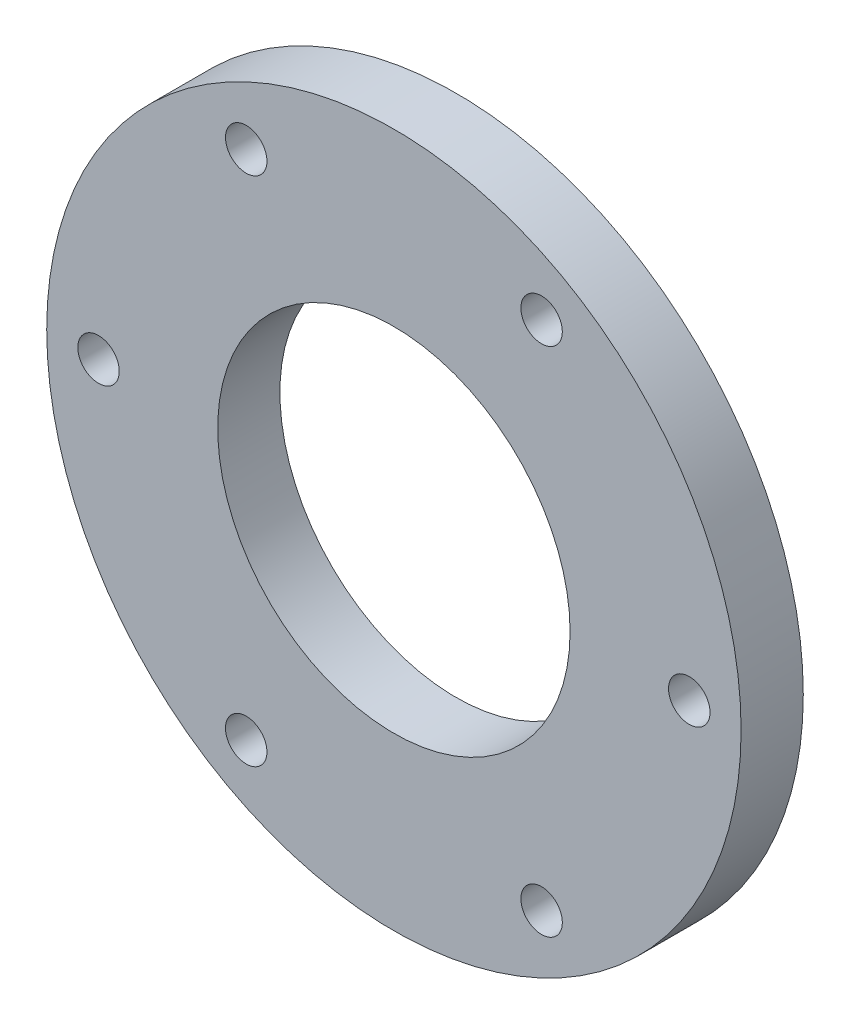
ISO-10303-21;
HEADER;
FILE_DESCRIPTION(('STEP AP214'),'2;1');
FILE_NAME('part.step','',(''),(''),'','','');
FILE_SCHEMA(('AUTOMOTIVE_DESIGN { 1 0 10303 214 1 1 1 1 }'));
ENDSEC;
DATA;
#1=APPLICATION_CONTEXT('core data for automotive mechanical design processes');
#2=APPLICATION_PROTOCOL_DEFINITION('international standard','automotive_design',2000,#1);
#3=PRODUCT_CONTEXT('',#1,'mechanical');
#4=PRODUCT('Part','Part','',(#3));
#5=PRODUCT_RELATED_PRODUCT_CATEGORY('part','',(#4));
#6=PRODUCT_DEFINITION_FORMATION('','',#4);
#7=PRODUCT_DEFINITION_CONTEXT('part definition',#1,'design');
#8=PRODUCT_DEFINITION('design','',#6,#7);
#9=PRODUCT_DEFINITION_SHAPE('','',#8);
#10=(LENGTH_UNIT() NAMED_UNIT(*) SI_UNIT(.MILLI.,.METRE.));
#11=(NAMED_UNIT(*) PLANE_ANGLE_UNIT() SI_UNIT($,.RADIAN.));
#12=(NAMED_UNIT(*) SI_UNIT($,.STERADIAN.) SOLID_ANGLE_UNIT());
#13=UNCERTAINTY_MEASURE_WITH_UNIT(LENGTH_MEASURE(1.E-05),#10,'distance_accuracy_value','');
#14=(GEOMETRIC_REPRESENTATION_CONTEXT(3) GLOBAL_UNCERTAINTY_ASSIGNED_CONTEXT((#13)) GLOBAL_UNIT_ASSIGNED_CONTEXT((#10,
#11,#12)) REPRESENTATION_CONTEXT('',''));
#15=CARTESIAN_POINT('',(0.,0.,0.));
#16=DIRECTION('',(0.,0.,1.));
#17=DIRECTION('',(1.,0.,0.));
#18=AXIS2_PLACEMENT_3D('',#15,#16,#17);
#19=CARTESIAN_POINT('',(0.,0.,6.));
#20=DIRECTION('',(0.,0.,1.));
#21=DIRECTION('',(1.,0.,0.));
#22=AXIS2_PLACEMENT_3D('',#19,#20,#21);
#23=PLANE('',#22);
#24=CARTESIAN_POINT('',(28.5,0.,6.));
#25=DIRECTION('',(0.,0.,1.));
#26=DIRECTION('',(1.,0.,0.));
#27=AXIS2_PLACEMENT_3D('',#24,#25,#26);
#28=CIRCLE('',#27,1.99999999999999);
#29=CARTESIAN_POINT('',(30.5,0.,6.));
#30=VERTEX_POINT('',#29);
#31=EDGE_CURVE('E36',#30,#30,#28,.T.);
#32=ORIENTED_EDGE('',*,*,#31,.F.);
#33=EDGE_LOOP('',(#32));
#34=FACE_BOUND('',#33,.T.);
#35=CARTESIAN_POINT('',(14.2499999999999,24.6817240078565,6.));
#36=DIRECTION('',(0.,0.,1.));
#37=DIRECTION('',(1.,0.,0.));
#38=AXIS2_PLACEMENT_3D('',#35,#36,#37);
#39=CIRCLE('',#38,1.99999999999999);
#40=CARTESIAN_POINT('',(16.2499999999999,24.6817240078565,6.));
#41=VERTEX_POINT('',#40);
#42=EDGE_CURVE('E69',#41,#41,#39,.T.);
#43=ORIENTED_EDGE('',*,*,#42,.F.);
#44=EDGE_LOOP('',(#43));
#45=FACE_BOUND('',#44,.T.);
#46=CARTESIAN_POINT('',(-14.2500000000001,24.6817240078564,6.));
#47=DIRECTION('',(0.,0.,1.));
#48=DIRECTION('',(1.,0.,0.));
#49=AXIS2_PLACEMENT_3D('',#46,#47,#48);
#50=CIRCLE('',#49,1.99999999999999);
#51=CARTESIAN_POINT('',(-12.2500000000001,24.6817240078564,6.));
#52=VERTEX_POINT('',#51);
#53=EDGE_CURVE('E65',#52,#52,#50,.T.);
#54=ORIENTED_EDGE('',*,*,#53,.F.);
#55=EDGE_LOOP('',(#54));
#56=FACE_BOUND('',#55,.T.);
#57=CARTESIAN_POINT('',(-28.5,-1.99014436314059E-13,6.));
#58=DIRECTION('',(0.,0.,1.));
#59=DIRECTION('',(1.,0.,0.));
#60=AXIS2_PLACEMENT_3D('',#57,#58,#59);
#61=CIRCLE('',#60,1.99999999999999);
#62=CARTESIAN_POINT('',(-26.5,-1.99014436314059E-13,6.));
#63=VERTEX_POINT('',#62);
#64=EDGE_CURVE('E60',#63,#63,#61,.T.);
#65=ORIENTED_EDGE('',*,*,#64,.F.);
#66=EDGE_LOOP('',(#65));
#67=FACE_BOUND('',#66,.T.);
#68=CARTESIAN_POINT('',(-14.2499999999998,-24.6817240078566,6.));
#69=DIRECTION('',(0.,0.,1.));
#70=DIRECTION('',(1.,0.,0.));
#71=AXIS2_PLACEMENT_3D('',#68,#69,#70);
#72=CIRCLE('',#71,1.99999999999999);
#73=CARTESIAN_POINT('',(-12.2499999999998,-24.6817240078566,6.));
#74=VERTEX_POINT('',#73);
#75=EDGE_CURVE('E55',#74,#74,#72,.T.);
#76=ORIENTED_EDGE('',*,*,#75,.F.);
#77=EDGE_LOOP('',(#76));
#78=FACE_BOUND('',#77,.T.);
#79=CARTESIAN_POINT('',(14.2500000000003,-24.6817240078563,6.));
#80=DIRECTION('',(0.,0.,1.));
#81=DIRECTION('',(1.,0.,0.));
#82=AXIS2_PLACEMENT_3D('',#79,#80,#81);
#83=CIRCLE('',#82,1.99999999999999);
#84=CARTESIAN_POINT('',(16.2500000000003,-24.6817240078563,6.));
#85=VERTEX_POINT('',#84);
#86=EDGE_CURVE('E51',#85,#85,#83,.T.);
#87=ORIENTED_EDGE('',*,*,#86,.F.);
#88=EDGE_LOOP('',(#87));
#89=FACE_BOUND('',#88,.T.);
#90=CARTESIAN_POINT('',(0.,0.,6.));
#91=DIRECTION('',(0.,0.,1.));
#92=DIRECTION('',(1.,0.,0.));
#93=AXIS2_PLACEMENT_3D('',#90,#91,#92);
#94=CIRCLE('',#93,33.5);
#95=CARTESIAN_POINT('',(33.5,0.,6.));
#96=VERTEX_POINT('',#95);
#97=EDGE_CURVE('E10',#96,#96,#94,.T.);
#98=ORIENTED_EDGE('',*,*,#97,.T.);
#99=EDGE_LOOP('',(#98));
#100=FACE_BOUND('',#99,.T.);
#101=CARTESIAN_POINT('',(0.,0.,6.));
#102=DIRECTION('',(0.,0.,1.));
#103=DIRECTION('',(1.,0.,0.));
#104=AXIS2_PLACEMENT_3D('',#101,#102,#103);
#105=CIRCLE('',#104,17.);
#106=CARTESIAN_POINT('',(17.,0.,6.));
#107=VERTEX_POINT('',#106);
#108=EDGE_CURVE('E45',#107,#107,#105,.T.);
#109=ORIENTED_EDGE('',*,*,#108,.F.);
#110=EDGE_LOOP('',(#109));
#111=FACE_BOUND('',#110,.T.);
#112=ADVANCED_FACE('F32',(#34,#45,#56,#67,#78,#89,#100,#111),#23,.T.);
#113=CARTESIAN_POINT('',(0.,0.,0.));
#114=DIRECTION('',(0.,0.,1.));
#115=DIRECTION('',(1.,0.,0.));
#116=AXIS2_PLACEMENT_3D('',#113,#114,#115);
#117=PLANE('',#116);
#118=CARTESIAN_POINT('',(28.5,0.,0.));
#119=DIRECTION('',(0.,0.,-1.));
#120=DIRECTION('',(-1.,0.,0.));
#121=AXIS2_PLACEMENT_3D('',#118,#119,#120);
#122=CIRCLE('',#121,2.025);
#123=CARTESIAN_POINT('',(26.475,0.,0.));
#124=VERTEX_POINT('',#123);
#125=EDGE_CURVE('E198',#124,#124,#122,.T.);
#126=ORIENTED_EDGE('',*,*,#125,.F.);
#127=EDGE_LOOP('',(#126));
#128=FACE_BOUND('',#127,.T.);
#129=CARTESIAN_POINT('',(14.2499999999999,24.6817240078565,0.));
#130=DIRECTION('',(0.,0.,-1.));
#131=DIRECTION('',(-1.,0.,0.));
#132=AXIS2_PLACEMENT_3D('',#129,#130,#131);
#133=CIRCLE('',#132,2.025);
#134=CARTESIAN_POINT('',(12.2249999999999,24.6817240078565,0.));
#135=VERTEX_POINT('',#134);
#136=EDGE_CURVE('E78',#135,#135,#133,.T.);
#137=ORIENTED_EDGE('',*,*,#136,.F.);
#138=EDGE_LOOP('',(#137));
#139=FACE_BOUND('',#138,.T.);
#140=CARTESIAN_POINT('',(-14.2500000000001,24.6817240078564,0.));
#141=DIRECTION('',(0.,0.,-1.));
#142=DIRECTION('',(-1.,0.,0.));
#143=AXIS2_PLACEMENT_3D('',#140,#141,#142);
#144=CIRCLE('',#143,2.025);
#145=CARTESIAN_POINT('',(-16.2750000000001,24.6817240078564,0.));
#146=VERTEX_POINT('',#145);
#147=EDGE_CURVE('E71',#146,#146,#144,.T.);
#148=ORIENTED_EDGE('',*,*,#147,.F.);
#149=EDGE_LOOP('',(#148));
#150=FACE_BOUND('',#149,.T.);
#151=CARTESIAN_POINT('',(-28.5,-1.99014436314059E-13,0.));
#152=DIRECTION('',(0.,0.,-1.));
#153=DIRECTION('',(-1.,0.,0.));
#154=AXIS2_PLACEMENT_3D('',#151,#152,#153);
#155=CIRCLE('',#154,2.025);
#156=CARTESIAN_POINT('',(-30.525,-1.99014436314059E-13,0.));
#157=VERTEX_POINT('',#156);
#158=EDGE_CURVE('E67',#157,#157,#155,.T.);
#159=ORIENTED_EDGE('',*,*,#158,.F.);
#160=EDGE_LOOP('',(#159));
#161=FACE_BOUND('',#160,.T.);
#162=CARTESIAN_POINT('',(-14.2499999999998,-24.6817240078566,0.));
#163=DIRECTION('',(0.,0.,-1.));
#164=DIRECTION('',(-1.,0.,0.));
#165=AXIS2_PLACEMENT_3D('',#162,#163,#164);
#166=CIRCLE('',#165,2.025);
#167=CARTESIAN_POINT('',(-16.2749999999998,-24.6817240078566,0.));
#168=VERTEX_POINT('',#167);
#169=EDGE_CURVE('E63',#168,#168,#166,.T.);
#170=ORIENTED_EDGE('',*,*,#169,.F.);
#171=EDGE_LOOP('',(#170));
#172=FACE_BOUND('',#171,.T.);
#173=CARTESIAN_POINT('',(14.2500000000003,-24.6817240078563,0.));
#174=DIRECTION('',(0.,0.,-1.));
#175=DIRECTION('',(-1.,0.,0.));
#176=AXIS2_PLACEMENT_3D('',#173,#174,#175);
#177=CIRCLE('',#176,2.025);
#178=CARTESIAN_POINT('',(12.2250000000003,-24.6817240078563,0.));
#179=VERTEX_POINT('',#178);
#180=EDGE_CURVE('E58',#179,#179,#177,.T.);
#181=ORIENTED_EDGE('',*,*,#180,.F.);
#182=EDGE_LOOP('',(#181));
#183=FACE_BOUND('',#182,.T.);
#184=CARTESIAN_POINT('',(0.,0.,0.));
#185=DIRECTION('',(0.,0.,1.));
#186=DIRECTION('',(1.,0.,0.));
#187=AXIS2_PLACEMENT_3D('',#184,#185,#186);
#188=CIRCLE('',#187,33.5);
#189=CARTESIAN_POINT('',(33.5,0.,0.));
#190=VERTEX_POINT('',#189);
#191=EDGE_CURVE('E40',#190,#190,#188,.T.);
#192=ORIENTED_EDGE('',*,*,#191,.F.);
#193=EDGE_LOOP('',(#192));
#194=FACE_BOUND('',#193,.T.);
#195=CARTESIAN_POINT('',(0.,0.,0.));
#196=DIRECTION('',(0.,0.,1.));
#197=DIRECTION('',(1.,0.,0.));
#198=AXIS2_PLACEMENT_3D('',#195,#196,#197);
#199=CIRCLE('',#198,17.);
#200=CARTESIAN_POINT('',(17.,0.,0.));
#201=VERTEX_POINT('',#200);
#202=EDGE_CURVE('E48',#201,#201,#199,.T.);
#203=ORIENTED_EDGE('',*,*,#202,.T.);
#204=EDGE_LOOP('',(#203));
#205=FACE_BOUND('',#204,.T.);
#206=ADVANCED_FACE('F105',(#128,#139,#150,#161,#172,#183,#194,#205),#117,.F.);
#207=CARTESIAN_POINT('',(0.,0.,6.));
#208=DIRECTION('',(0.,0.,-1.));
#209=DIRECTION('',(-1.,0.,0.));
#210=AXIS2_PLACEMENT_3D('',#207,#208,#209);
#211=CYLINDRICAL_SURFACE('',#210,33.5);
#212=ORIENTED_EDGE('',*,*,#97,.F.);
#213=EDGE_LOOP('',(#212));
#214=FACE_BOUND('',#213,.T.);
#215=ORIENTED_EDGE('',*,*,#191,.T.);
#216=EDGE_LOOP('',(#215));
#217=FACE_BOUND('',#216,.T.);
#218=ADVANCED_FACE('F34',(#214,#217),#211,.T.);
#219=CARTESIAN_POINT('',(0.,0.,6.));
#220=DIRECTION('',(0.,0.,-1.));
#221=DIRECTION('',(-1.,0.,0.));
#222=AXIS2_PLACEMENT_3D('',#219,#220,#221);
#223=CYLINDRICAL_SURFACE('',#222,17.);
#224=ORIENTED_EDGE('',*,*,#108,.T.);
#225=EDGE_LOOP('',(#224));
#226=FACE_BOUND('',#225,.T.);
#227=ORIENTED_EDGE('',*,*,#202,.F.);
#228=EDGE_LOOP('',(#227));
#229=FACE_BOUND('',#228,.T.);
#230=ADVANCED_FACE('F107',(#226,#229),#223,.F.);
#231=CARTESIAN_POINT('',(14.2500000000003,-24.6817240078563,0.));
#232=DIRECTION('',(0.,0.,-1.));
#233=DIRECTION('',(-1.,0.,0.));
#234=AXIS2_PLACEMENT_3D('',#231,#232,#233);
#235=CYLINDRICAL_SURFACE('',#234,1.99999999999999);
#236=ORIENTED_EDGE('',*,*,#86,.T.);
#237=EDGE_LOOP('',(#236));
#238=FACE_BOUND('',#237,.T.);
#239=CARTESIAN_POINT('',(14.2500000000003,-24.6817240078563,0.0250000000000111));
#240=DIRECTION('',(0.,0.,-1.));
#241=DIRECTION('',(-1.,0.,0.));
#242=AXIS2_PLACEMENT_3D('',#239,#240,#241);
#243=CIRCLE('',#242,1.99999999999999);
#244=CARTESIAN_POINT('',(12.2500000000003,-24.6817240078563,0.0250000000000111));
#245=VERTEX_POINT('',#244);
#246=EDGE_CURVE('E54',#245,#245,#243,.T.);
#247=ORIENTED_EDGE('',*,*,#246,.T.);
#248=EDGE_LOOP('',(#247));
#249=FACE_BOUND('',#248,.T.);
#250=ADVANCED_FACE('F109',(#238,#249),#235,.F.);
#251=CARTESIAN_POINT('',(14.2500000000003,-24.6817240078563,0.));
#252=DIRECTION('',(0.,0.,-1.));
#253=DIRECTION('',(-1.,0.,0.));
#254=AXIS2_PLACEMENT_3D('',#251,#252,#253);
#255=CONICAL_SURFACE('',#254,2.025,0.785398163397414);
#256=ORIENTED_EDGE('',*,*,#246,.F.);
#257=EDGE_LOOP('',(#256));
#258=FACE_BOUND('',#257,.T.);
#259=ORIENTED_EDGE('',*,*,#180,.T.);
#260=EDGE_LOOP('',(#259));
#261=FACE_BOUND('',#260,.T.);
#262=ADVANCED_FACE('F115',(#258,#261),#255,.F.);
#263=CARTESIAN_POINT('',(-14.2499999999998,-24.6817240078566,0.));
#264=DIRECTION('',(0.,0.,-1.));
#265=DIRECTION('',(-1.,0.,0.));
#266=AXIS2_PLACEMENT_3D('',#263,#264,#265);
#267=CYLINDRICAL_SURFACE('',#266,1.99999999999999);
#268=ORIENTED_EDGE('',*,*,#75,.T.);
#269=EDGE_LOOP('',(#268));
#270=FACE_BOUND('',#269,.T.);
#271=CARTESIAN_POINT('',(-14.2499999999998,-24.6817240078566,0.0250000000000111));
#272=DIRECTION('',(0.,0.,-1.));
#273=DIRECTION('',(-1.,0.,0.));
#274=AXIS2_PLACEMENT_3D('',#271,#272,#273);
#275=CIRCLE('',#274,1.99999999999999);
#276=CARTESIAN_POINT('',(-16.2499999999998,-24.6817240078566,0.0250000000000111));
#277=VERTEX_POINT('',#276);
#278=EDGE_CURVE('E59',#277,#277,#275,.T.);
#279=ORIENTED_EDGE('',*,*,#278,.T.);
#280=EDGE_LOOP('',(#279));
#281=FACE_BOUND('',#280,.T.);
#282=ADVANCED_FACE('F143',(#270,#281),#267,.F.);
#283=CARTESIAN_POINT('',(-14.2499999999998,-24.6817240078566,0.));
#284=DIRECTION('',(0.,0.,-1.));
#285=DIRECTION('',(-1.,0.,0.));
#286=AXIS2_PLACEMENT_3D('',#283,#284,#285);
#287=CONICAL_SURFACE('',#286,2.025,0.785398163397379);
#288=ORIENTED_EDGE('',*,*,#278,.F.);
#289=EDGE_LOOP('',(#288));
#290=FACE_BOUND('',#289,.T.);
#291=ORIENTED_EDGE('',*,*,#169,.T.);
#292=EDGE_LOOP('',(#291));
#293=FACE_BOUND('',#292,.T.);
#294=ADVANCED_FACE('F153',(#290,#293),#287,.F.);
#295=CARTESIAN_POINT('',(-28.5,-1.99014436314059E-13,0.));
#296=DIRECTION('',(0.,0.,-1.));
#297=DIRECTION('',(-1.,0.,0.));
#298=AXIS2_PLACEMENT_3D('',#295,#296,#297);
#299=CYLINDRICAL_SURFACE('',#298,1.99999999999999);
#300=ORIENTED_EDGE('',*,*,#64,.T.);
#301=EDGE_LOOP('',(#300));
#302=FACE_BOUND('',#301,.T.);
#303=CARTESIAN_POINT('',(-28.5,-1.99014436314059E-13,0.0250000000000111));
#304=DIRECTION('',(0.,0.,-1.));
#305=DIRECTION('',(-1.,0.,0.));
#306=AXIS2_PLACEMENT_3D('',#303,#304,#305);
#307=CIRCLE('',#306,1.99999999999999);
#308=CARTESIAN_POINT('',(-30.5,-1.99014436314059E-13,0.0250000000000111));
#309=VERTEX_POINT('',#308);
#310=EDGE_CURVE('E64',#309,#309,#307,.T.);
#311=ORIENTED_EDGE('',*,*,#310,.T.);
#312=EDGE_LOOP('',(#311));
#313=FACE_BOUND('',#312,.T.);
#314=ADVANCED_FACE('F159',(#302,#313),#299,.F.);
#315=CARTESIAN_POINT('',(-28.5,-1.99014436314059E-13,0.));
#316=DIRECTION('',(0.,0.,-1.));
#317=DIRECTION('',(-1.,0.,0.));
#318=AXIS2_PLACEMENT_3D('',#315,#316,#317);
#319=CONICAL_SURFACE('',#318,2.025,0.785398163397344);
#320=ORIENTED_EDGE('',*,*,#310,.F.);
#321=EDGE_LOOP('',(#320));
#322=FACE_BOUND('',#321,.T.);
#323=ORIENTED_EDGE('',*,*,#158,.T.);
#324=EDGE_LOOP('',(#323));
#325=FACE_BOUND('',#324,.T.);
#326=ADVANCED_FACE('F163',(#322,#325),#319,.F.);
#327=CARTESIAN_POINT('',(-14.2500000000001,24.6817240078564,0.));
#328=DIRECTION('',(0.,0.,-1.));
#329=DIRECTION('',(-1.,0.,0.));
#330=AXIS2_PLACEMENT_3D('',#327,#328,#329);
#331=CYLINDRICAL_SURFACE('',#330,1.99999999999999);
#332=ORIENTED_EDGE('',*,*,#53,.T.);
#333=EDGE_LOOP('',(#332));
#334=FACE_BOUND('',#333,.T.);
#335=CARTESIAN_POINT('',(-14.2500000000001,24.6817240078564,0.0250000000000111));
#336=DIRECTION('',(0.,0.,-1.));
#337=DIRECTION('',(-1.,0.,0.));
#338=AXIS2_PLACEMENT_3D('',#335,#336,#337);
#339=CIRCLE('',#338,1.99999999999999);
#340=CARTESIAN_POINT('',(-16.2500000000001,24.6817240078564,0.0250000000000111));
#341=VERTEX_POINT('',#340);
#342=EDGE_CURVE('E68',#341,#341,#339,.T.);
#343=ORIENTED_EDGE('',*,*,#342,.T.);
#344=EDGE_LOOP('',(#343));
#345=FACE_BOUND('',#344,.T.);
#346=ADVANCED_FACE('F167',(#334,#345),#331,.F.);
#347=CARTESIAN_POINT('',(-14.2500000000001,24.6817240078564,0.));
#348=DIRECTION('',(0.,0.,-1.));
#349=DIRECTION('',(-1.,0.,0.));
#350=AXIS2_PLACEMENT_3D('',#347,#348,#349);
#351=CONICAL_SURFACE('',#350,2.025,0.785398163397379);
#352=ORIENTED_EDGE('',*,*,#342,.F.);
#353=EDGE_LOOP('',(#352));
#354=FACE_BOUND('',#353,.T.);
#355=ORIENTED_EDGE('',*,*,#147,.T.);
#356=EDGE_LOOP('',(#355));
#357=FACE_BOUND('',#356,.T.);
#358=ADVANCED_FACE('F171',(#354,#357),#351,.F.);
#359=CARTESIAN_POINT('',(14.2499999999999,24.6817240078565,0.));
#360=DIRECTION('',(0.,0.,-1.));
#361=DIRECTION('',(-1.,0.,0.));
#362=AXIS2_PLACEMENT_3D('',#359,#360,#361);
#363=CYLINDRICAL_SURFACE('',#362,1.99999999999999);
#364=ORIENTED_EDGE('',*,*,#42,.T.);
#365=EDGE_LOOP('',(#364));
#366=FACE_BOUND('',#365,.T.);
#367=CARTESIAN_POINT('',(14.2499999999999,24.6817240078565,0.0250000000000111));
#368=DIRECTION('',(0.,0.,-1.));
#369=DIRECTION('',(-1.,0.,0.));
#370=AXIS2_PLACEMENT_3D('',#367,#368,#369);
#371=CIRCLE('',#370,1.99999999999999);
#372=CARTESIAN_POINT('',(12.25,24.6817240078565,0.0250000000000111));
#373=VERTEX_POINT('',#372);
#374=EDGE_CURVE('E72',#373,#373,#371,.T.);
#375=ORIENTED_EDGE('',*,*,#374,.T.);
#376=EDGE_LOOP('',(#375));
#377=FACE_BOUND('',#376,.T.);
#378=ADVANCED_FACE('F175',(#366,#377),#363,.F.);
#379=CARTESIAN_POINT('',(14.2499999999999,24.6817240078565,0.));
#380=DIRECTION('',(0.,0.,-1.));
#381=DIRECTION('',(-1.,0.,0.));
#382=AXIS2_PLACEMENT_3D('',#379,#380,#381);
#383=CONICAL_SURFACE('',#382,2.025,0.785398163397414);
#384=ORIENTED_EDGE('',*,*,#374,.F.);
#385=EDGE_LOOP('',(#384));
#386=FACE_BOUND('',#385,.T.);
#387=ORIENTED_EDGE('',*,*,#136,.T.);
#388=EDGE_LOOP('',(#387));
#389=FACE_BOUND('',#388,.T.);
#390=ADVANCED_FACE('F179',(#386,#389),#383,.F.);
#391=CARTESIAN_POINT('',(28.5,0.,0.));
#392=DIRECTION('',(0.,0.,-1.));
#393=DIRECTION('',(-1.,0.,0.));
#394=AXIS2_PLACEMENT_3D('',#391,#392,#393);
#395=CYLINDRICAL_SURFACE('',#394,1.99999999999999);
#396=ORIENTED_EDGE('',*,*,#31,.T.);
#397=EDGE_LOOP('',(#396));
#398=FACE_BOUND('',#397,.T.);
#399=CARTESIAN_POINT('',(28.5,0.,0.0250000000000111));
#400=DIRECTION('',(0.,0.,-1.));
#401=DIRECTION('',(-1.,0.,0.));
#402=AXIS2_PLACEMENT_3D('',#399,#400,#401);
#403=CIRCLE('',#402,1.99999999999999);
#404=CARTESIAN_POINT('',(26.5,0.,0.0250000000000111));
#405=VERTEX_POINT('',#404);
#406=EDGE_CURVE('E195',#405,#405,#403,.T.);
#407=ORIENTED_EDGE('',*,*,#406,.T.);
#408=EDGE_LOOP('',(#407));
#409=FACE_BOUND('',#408,.T.);
#410=ADVANCED_FACE('F182',(#398,#409),#395,.F.);
#411=CARTESIAN_POINT('',(28.5,0.,0.));
#412=DIRECTION('',(0.,0.,-1.));
#413=DIRECTION('',(-1.,0.,0.));
#414=AXIS2_PLACEMENT_3D('',#411,#412,#413);
#415=CONICAL_SURFACE('',#414,2.025,0.785398163397344);
#416=ORIENTED_EDGE('',*,*,#406,.F.);
#417=EDGE_LOOP('',(#416));
#418=FACE_BOUND('',#417,.T.);
#419=ORIENTED_EDGE('',*,*,#125,.T.);
#420=EDGE_LOOP('',(#419));
#421=FACE_BOUND('',#420,.T.);
#422=ADVANCED_FACE('F186',(#418,#421),#415,.F.);
#423=CLOSED_SHELL('',(#112,#206,#218,#230,#250,#262,#282,#294,#314,#326,#346,#358,#378,#390,
#410,#422));
#424=MANIFOLD_SOLID_BREP('B2',#423);
#425=ADVANCED_BREP_SHAPE_REPRESENTATION('',(#18,#424),#14);
#426=SHAPE_DEFINITION_REPRESENTATION(#9,#425);
ENDSEC;
END-ISO-10303-21;
